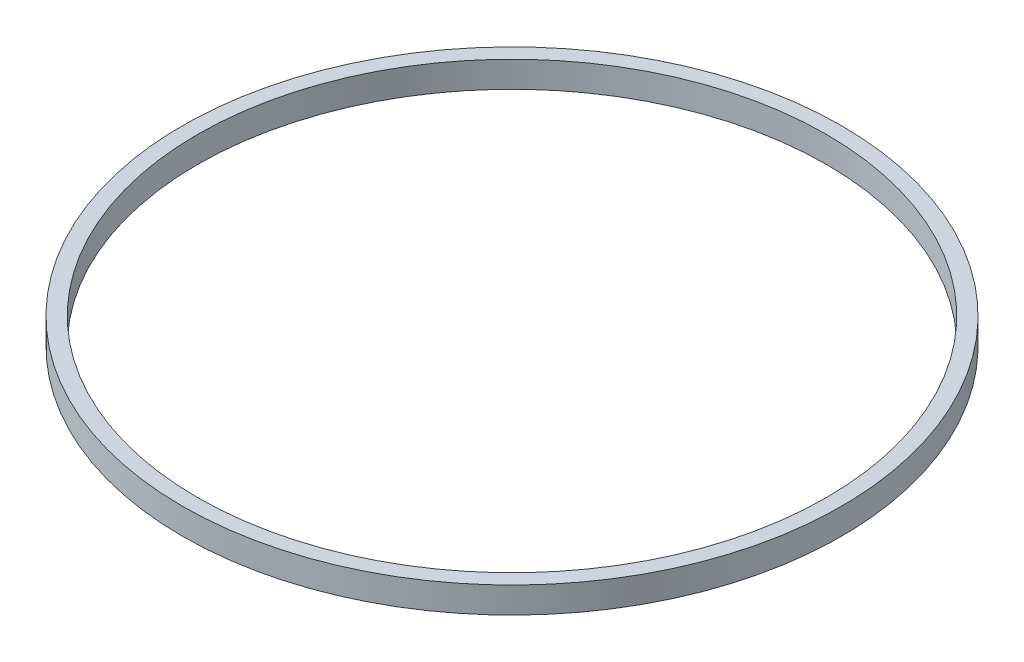
ISO-10303-21;
HEADER;
FILE_DESCRIPTION(('STEP AP214'),'2;1');
FILE_NAME('part.step','',(''),(''),'','','');
FILE_SCHEMA(('AUTOMOTIVE_DESIGN { 1 0 10303 214 1 1 1 1 }'));
ENDSEC;
DATA;
#1=APPLICATION_CONTEXT('core data for automotive mechanical design processes');
#2=APPLICATION_PROTOCOL_DEFINITION('international standard','automotive_design',2000,#1);
#3=PRODUCT_CONTEXT('',#1,'mechanical');
#4=PRODUCT('Part','Part','',(#3));
#5=PRODUCT_RELATED_PRODUCT_CATEGORY('part','',(#4));
#6=PRODUCT_DEFINITION_FORMATION('','',#4);
#7=PRODUCT_DEFINITION_CONTEXT('part definition',#1,'design');
#8=PRODUCT_DEFINITION('design','',#6,#7);
#9=PRODUCT_DEFINITION_SHAPE('','',#8);
#10=(LENGTH_UNIT() NAMED_UNIT(*) SI_UNIT(.MILLI.,.METRE.));
#11=(NAMED_UNIT(*) PLANE_ANGLE_UNIT() SI_UNIT($,.RADIAN.));
#12=(NAMED_UNIT(*) SI_UNIT($,.STERADIAN.) SOLID_ANGLE_UNIT());
#13=UNCERTAINTY_MEASURE_WITH_UNIT(LENGTH_MEASURE(1.E-05),#10,'distance_accuracy_value','');
#14=(GEOMETRIC_REPRESENTATION_CONTEXT(3) GLOBAL_UNCERTAINTY_ASSIGNED_CONTEXT((#13)) GLOBAL_UNIT_ASSIGNED_CONTEXT((#10,
#11,#12)) REPRESENTATION_CONTEXT('',''));
#15=CARTESIAN_POINT('',(0.,0.,0.));
#16=DIRECTION('',(0.,0.,1.));
#17=DIRECTION('',(1.,0.,0.));
#18=AXIS2_PLACEMENT_3D('',#15,#16,#17);
#19=CARTESIAN_POINT('',(0.,9.5,0.));
#20=DIRECTION('',(0.,1.,0.));
#21=DIRECTION('',(0.,0.,1.));
#22=AXIS2_PLACEMENT_3D('',#19,#20,#21);
#23=PLANE('',#22);
#24=CARTESIAN_POINT('',(0.,9.5,0.));
#25=DIRECTION('',(0.,1.,0.));
#26=DIRECTION('',(0.,0.,1.));
#27=AXIS2_PLACEMENT_3D('',#24,#25,#26);
#28=CIRCLE('',#27,240.5);
#29=CARTESIAN_POINT('',(0.,9.5,240.5));
#30=VERTEX_POINT('',#29);
#31=EDGE_CURVE('E10',#30,#30,#28,.T.);
#32=ORIENTED_EDGE('',*,*,#31,.T.);
#33=EDGE_LOOP('',(#32));
#34=FACE_BOUND('',#33,.T.);
#35=CARTESIAN_POINT('',(0.,9.5,0.));
#36=DIRECTION('',(0.,1.,0.));
#37=DIRECTION('',(0.,0.,1.));
#38=AXIS2_PLACEMENT_3D('',#35,#36,#37);
#39=CIRCLE('',#38,229.5);
#40=CARTESIAN_POINT('',(0.,9.5,229.5));
#41=VERTEX_POINT('',#40);
#42=EDGE_CURVE('E50',#41,#41,#39,.T.);
#43=ORIENTED_EDGE('',*,*,#42,.F.);
#44=EDGE_LOOP('',(#43));
#45=FACE_BOUND('',#44,.T.);
#46=ADVANCED_FACE('F36',(#34,#45),#23,.T.);
#47=CARTESIAN_POINT('',(0.,-9.5,0.));
#48=DIRECTION('',(0.,1.,0.));
#49=DIRECTION('',(0.,0.,1.));
#50=AXIS2_PLACEMENT_3D('',#47,#48,#49);
#51=PLANE('',#50);
#52=CARTESIAN_POINT('',(0.,-9.5,0.));
#53=DIRECTION('',(0.,1.,0.));
#54=DIRECTION('',(0.,0.,1.));
#55=AXIS2_PLACEMENT_3D('',#52,#53,#54);
#56=CIRCLE('',#55,240.5);
#57=CARTESIAN_POINT('',(0.,-9.5,240.5));
#58=VERTEX_POINT('',#57);
#59=EDGE_CURVE('E40',#58,#58,#56,.T.);
#60=ORIENTED_EDGE('',*,*,#59,.F.);
#61=EDGE_LOOP('',(#60));
#62=FACE_BOUND('',#61,.T.);
#63=CARTESIAN_POINT('',(0.,-9.5,0.));
#64=DIRECTION('',(0.,1.,0.));
#65=DIRECTION('',(0.,0.,1.));
#66=AXIS2_PLACEMENT_3D('',#63,#64,#65);
#67=CIRCLE('',#66,229.5);
#68=CARTESIAN_POINT('',(0.,-9.5,229.5));
#69=VERTEX_POINT('',#68);
#70=EDGE_CURVE('E52',#69,#69,#67,.T.);
#71=ORIENTED_EDGE('',*,*,#70,.T.);
#72=EDGE_LOOP('',(#71));
#73=FACE_BOUND('',#72,.T.);
#74=ADVANCED_FACE('F65',(#62,#73),#51,.F.);
#75=CARTESIAN_POINT('',(0.,9.5,0.));
#76=DIRECTION('',(0.,-1.,0.));
#77=DIRECTION('',(0.,0.,-1.));
#78=AXIS2_PLACEMENT_3D('',#75,#76,#77);
#79=CYLINDRICAL_SURFACE('',#78,240.5);
#80=ORIENTED_EDGE('',*,*,#31,.F.);
#81=EDGE_LOOP('',(#80));
#82=FACE_BOUND('',#81,.T.);
#83=ORIENTED_EDGE('',*,*,#59,.T.);
#84=EDGE_LOOP('',(#83));
#85=FACE_BOUND('',#84,.T.);
#86=ADVANCED_FACE('F38',(#82,#85),#79,.T.);
#87=CARTESIAN_POINT('',(0.,9.5,0.));
#88=DIRECTION('',(0.,-1.,0.));
#89=DIRECTION('',(0.,0.,-1.));
#90=AXIS2_PLACEMENT_3D('',#87,#88,#89);
#91=CYLINDRICAL_SURFACE('',#90,229.5);
#92=ORIENTED_EDGE('',*,*,#42,.T.);
#93=EDGE_LOOP('',(#92));
#94=FACE_BOUND('',#93,.T.);
#95=ORIENTED_EDGE('',*,*,#70,.F.);
#96=EDGE_LOOP('',(#95));
#97=FACE_BOUND('',#96,.T.);
#98=ADVANCED_FACE('F61',(#94,#97),#91,.F.);
#99=CLOSED_SHELL('',(#46,#74,#86,#98));
#100=MANIFOLD_SOLID_BREP('B2',#99);
#101=ADVANCED_BREP_SHAPE_REPRESENTATION('',(#18,#100),#14);
#102=SHAPE_DEFINITION_REPRESENTATION(#9,#101);
ENDSEC;
END-ISO-10303-21;
